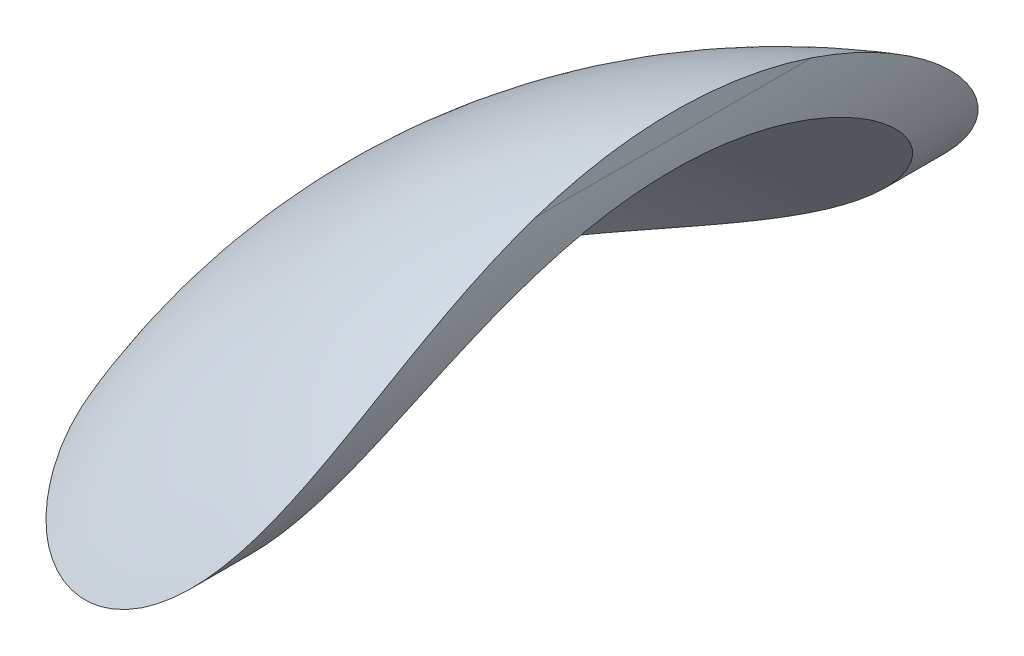
ISO-10303-21;
HEADER;
FILE_DESCRIPTION(('STEP AP214'),'2;1');
FILE_NAME('part.step','',(''),(''),'','','');
FILE_SCHEMA(('AUTOMOTIVE_DESIGN { 1 0 10303 214 1 1 1 1 }'));
ENDSEC;
DATA;
#1=APPLICATION_CONTEXT('core data for automotive mechanical design processes');
#2=APPLICATION_PROTOCOL_DEFINITION('international standard','automotive_design',2000,#1);
#3=PRODUCT_CONTEXT('',#1,'mechanical');
#4=PRODUCT('Part','Part','',(#3));
#5=PRODUCT_RELATED_PRODUCT_CATEGORY('part','',(#4));
#6=PRODUCT_DEFINITION_FORMATION('','',#4);
#7=PRODUCT_DEFINITION_CONTEXT('part definition',#1,'design');
#8=PRODUCT_DEFINITION('design','',#6,#7);
#9=PRODUCT_DEFINITION_SHAPE('','',#8);
#10=(LENGTH_UNIT() NAMED_UNIT(*) SI_UNIT(.MILLI.,.METRE.));
#11=(NAMED_UNIT(*) PLANE_ANGLE_UNIT() SI_UNIT($,.RADIAN.));
#12=(NAMED_UNIT(*) SI_UNIT($,.STERADIAN.) SOLID_ANGLE_UNIT());
#13=UNCERTAINTY_MEASURE_WITH_UNIT(LENGTH_MEASURE(1.E-05),#10,'distance_accuracy_value','');
#14=(GEOMETRIC_REPRESENTATION_CONTEXT(3) GLOBAL_UNCERTAINTY_ASSIGNED_CONTEXT((#13)) GLOBAL_UNIT_ASSIGNED_CONTEXT((#10,
#11,#12)) REPRESENTATION_CONTEXT('',''));
#15=CARTESIAN_POINT('',(0.,0.,0.));
#16=DIRECTION('',(0.,0.,1.));
#17=DIRECTION('',(1.,0.,0.));
#18=AXIS2_PLACEMENT_3D('',#15,#16,#17);
#19=CARTESIAN_POINT('',(0.,36.,0.));
#20=DIRECTION('',(0.,1.,0.));
#21=DIRECTION('',(-1.,0.,0.));
#22=AXIS2_PLACEMENT_3D('',#19,#20,#21);
#23=CIRCLE('',#22,17.);
#24=TRIMMED_CURVE('',#23,(PARAMETER_VALUE(-3.14159265358979)),
(PARAMETER_VALUE(3.14159265358979)),.T.,.PARAMETER.);
#25=CARTESIAN_POINT('',(17.,36.,0.));
#26=DIRECTION('',(0.,0.,-1.));
#27=AXIS1_PLACEMENT('',#25,#26);
#28=SURFACE_OF_REVOLUTION('',#24,#27);
#29=CARTESIAN_POINT('',(-10.,54.,7.09215695624266));
#30=CARTESIAN_POINT('',(-9.90105868243062,54.0000060865467,7.2715082776682));
#31=CARTESIAN_POINT('',(-9.79798799462409,54.000979208065,7.44859834177649));
#32=CARTESIAN_POINT('',(-9.58363051501969,54.0053947287687,7.79789055376422));
#33=CARTESIAN_POINT('',(-9.47233735672496,54.0088390597231,7.97008876809118));
#34=CARTESIAN_POINT('',(-9.24170628345666,54.0187350085244,8.30898858921577));
#35=CARTESIAN_POINT('',(-9.12236652293891,54.0251873182927,8.47568892189089));
#36=CARTESIAN_POINT('',(-8.87518839991979,54.0417170481246,8.80392150611222));
#37=CARTESIAN_POINT('',(-8.74730702813071,54.0518141502941,8.96542041028897));
#38=CARTESIAN_POINT('',(-8.48393053523839,54.0762265136883,9.2817058049186));
#39=CARTESIAN_POINT('',(-8.34843711672695,54.0905408346607,9.43649378279428));
#40=CARTESIAN_POINT('',(-8.0701847233763,54.1239974352365,9.73882365283748));
#41=CARTESIAN_POINT('',(-7.92742612123584,54.1431394673805,9.88636591594355));
#42=CARTESIAN_POINT('',(-7.56078792356969,54.1979764152567,10.2466564134348));
#43=CARTESIAN_POINT('',(-7.33252595192126,54.2371409494919,10.4544721785029));
#44=CARTESIAN_POINT('',(-6.86236777773813,54.3298717541419,10.8505939224528));
#45=CARTESIAN_POINT('',(-6.62047067378539,54.3834389776024,11.0388986091168));
#46=CARTESIAN_POINT('',(-6.1262162798958,54.5066065304424,11.3938760617822));
#47=CARTESIAN_POINT('',(-5.87389106470666,54.5761603187289,11.5606094670569));
#48=CARTESIAN_POINT('',(-5.36106232343689,54.7328313703029,11.8717470126975));
#49=CARTESIAN_POINT('',(-5.10055968058707,54.8199467422651,12.016153554637));
#50=CARTESIAN_POINT('',(-4.59526016567866,55.0051645856307,12.2712914981646));
#51=CARTESIAN_POINT('',(-4.35083439238189,55.1018689972162,12.3837759690584));
#52=CARTESIAN_POINT('',(-3.86045181243636,55.3114271935835,12.5885647338073));
#53=CARTESIAN_POINT('',(-3.61449505705686,55.4242804403292,12.6808696997307));
#54=CARTESIAN_POINT('',(-3.12352859737936,55.6662419827405,12.8451692968098));
#55=CARTESIAN_POINT('',(-2.87851981692398,55.7953633154792,12.9171474866478));
#56=CARTESIAN_POINT('',(-2.3922333381954,56.06942504613,13.0406780403534));
#57=CARTESIAN_POINT('',(-2.15095550449742,56.2143648683212,13.0922311472849));
#58=CARTESIAN_POINT('',(-1.69131396194676,56.5086072938328,13.1720777269069));
#59=CARTESIAN_POINT('',(-1.47253239615305,56.6568855648932,13.2017524276154));
#60=CARTESIAN_POINT('',(-1.0420467202903,56.9656646807537,13.2435909118597));
#61=CARTESIAN_POINT('',(-0.83034221607976,57.1261648432449,13.2557556721657));
#62=CARTESIAN_POINT('',(-0.41566970453251,57.4582862389076,13.2626114504365));
#63=CARTESIAN_POINT('',(-0.212698744630636,57.6299036636967,13.2573084215424));
#64=CARTESIAN_POINT('',(0.183173124490594,57.983043090212,13.2292253877149));
#65=CARTESIAN_POINT('',(0.376073930382359,58.1645651935287,13.2064452034898));
#66=CARTESIAN_POINT('',(0.750071857976493,58.5355295338204,13.1434307021884));
#67=CARTESIAN_POINT('',(0.931199149095012,58.7249493062611,13.1032431969488));
#68=CARTESIAN_POINT('',(1.2811838417351,59.1104767615005,13.0053520453278));
#69=CARTESIAN_POINT('',(1.45004138796096,59.3065843653856,12.9476486055637));
#70=CARTESIAN_POINT('',(1.77464372157792,59.7035762049356,12.8147082297684));
#71=CARTESIAN_POINT('',(1.93039119623717,59.9044594508228,12.7394748989402));
#72=CARTESIAN_POINT('',(2.22824111531833,60.3090151764394,12.5715384993016));
#73=CARTESIAN_POINT('',(2.37034360827497,60.5126876462448,12.4788354926337));
#74=CARTESIAN_POINT('',(2.64050687471467,60.9205577488878,12.2762557401469));
#75=CARTESIAN_POINT('',(2.76857730468861,61.124754920334,12.1663909325312));
#76=CARTESIAN_POINT('',(3.01076995257673,61.5316713437587,11.9298614007588));
#77=CARTESIAN_POINT('',(3.12489225792392,61.7343906049938,11.8031967819211));
#78=CARTESIAN_POINT('',(3.33946325521924,62.1362821896751,11.5336848746318));
#79=CARTESIAN_POINT('',(3.4399111272439,62.335454299811,11.3908366167441));
#80=CARTESIAN_POINT('',(3.62766160272476,62.7282979247084,11.0897819280073));
#81=CARTESIAN_POINT('',(3.71496381335952,62.9219692749547,10.9315750384405));
#82=CARTESIAN_POINT('',(3.88053819782568,63.3099237255637,10.5939417027983));
#83=CARTESIAN_POINT('',(3.95828791509912,63.5039011741397,10.4139084373058));
#84=CARTESIAN_POINT('',(4.1014215104651,63.8823008744403,10.0394850308557));
#85=CARTESIAN_POINT('',(4.16680509733521,64.0667229010605,9.84509455193553));
#86=CARTESIAN_POINT('',(4.2864273894923,64.4246725189078,9.44320106005376));
#87=CARTESIAN_POINT('',(4.3406626137561,64.5981966956233,9.2356939778596));
#88=CARTESIAN_POINT('',(4.439238946855,64.933198568557,8.80892707008353));
#89=CARTESIAN_POINT('',(4.4835788085369,65.094674744611,8.58966576738301));
#90=CARTESIAN_POINT('',(4.56913632136534,65.42600505296,8.10987137317313));
#91=CARTESIAN_POINT('',(4.60908970704305,65.5939660970732,7.84780467983986));
#92=CARTESIAN_POINT('',(4.67966511691762,65.9122799144506,7.31199543103473));
#93=CARTESIAN_POINT('',(4.71028643323911,66.0626313514222,7.03825199162876));
#94=CARTESIAN_POINT('',(4.76389492711926,66.3451747011281,6.48068083059862));
#95=CARTESIAN_POINT('',(4.78687850550703,66.4773580352574,6.19684842423877));
#96=CARTESIAN_POINT('',(4.82670383981941,66.7230856648512,5.62081802853676));
#97=CARTESIAN_POINT('',(4.8435452606057,66.8366289430612,5.32861958365123));
#98=CARTESIAN_POINT('',(4.87509351421215,67.0642362441262,4.68221614733304));
#99=CARTESIAN_POINT('',(4.88881757023498,67.1744535934525,4.32660408163413));
#100=CARTESIAN_POINT('',(4.91128111479605,67.3680735779839,3.60799431081621));
#101=CARTESIAN_POINT('',(4.92002009029322,67.4514734528752,3.24499584950407));
#102=CARTESIAN_POINT('',(4.93387876301776,67.5913787216016,2.51361910202883));
#103=CARTESIAN_POINT('',(4.93899681701417,67.6478719009608,2.14523845064355));
#104=CARTESIAN_POINT('',(4.9465298716766,67.7338663591566,1.40531603841123));
#105=CARTESIAN_POINT('',(4.94894476949845,67.7633666110134,1.03377415783403));
#106=CARTESIAN_POINT('',(4.95172680247294,67.7974008426505,0.241988484870862));
#107=CARTESIAN_POINT('',(4.95179322765221,67.7982676309586,-0.178418641905333));
#108=CARTESIAN_POINT('',(4.94913503948852,67.7656517544627,-1.01791967139099));
#109=CARTESIAN_POINT('',(4.94641016360782,67.732165858593,-1.43701344685311));
#110=CARTESIAN_POINT('',(4.93746713858115,67.6308135879049,-2.27137681954633));
#111=CARTESIAN_POINT('',(4.93124591159695,67.5629169264649,-2.68664271927989));
#112=CARTESIAN_POINT('',(4.91389322191333,67.3927982475849,-3.5099834879023));
#113=CARTESIAN_POINT('',(4.90276189434334,67.2905771747954,-3.91805855436657));
#114=CARTESIAN_POINT('',(4.87318835002513,67.0498064317697,-4.73124600261338));
#115=CARTESIAN_POINT('',(4.85461639248842,66.9106276950221,-5.13616833755762));
#116=CARTESIAN_POINT('',(4.80716576341052,66.5973038130857,-5.93171479419174));
#117=CARTESIAN_POINT('',(4.77828576490568,66.4231541673225,-6.32233706788011));
#118=CARTESIAN_POINT('',(4.7065451618489,66.0410762028488,-7.08463106581984));
#119=CARTESIAN_POINT('',(4.66371039396609,65.8332106621168,-7.45633635471443));
#120=CARTESIAN_POINT('',(4.585763083299,65.4973344116429,-7.99667219036317));
#121=CARTESIAN_POINT('',(4.55750245799856,65.3813784877647,-8.17389294957009));
#122=CARTESIAN_POINT('',(4.49581700371876,65.1416817463484,-8.52214061856858));
#123=CARTESIAN_POINT('',(4.46239095515515,65.0179390944227,-8.69316605380866));
#124=CARTESIAN_POINT('',(4.37530511911418,64.7122316229316,-9.0952226660856));
#125=CARTESIAN_POINT('',(4.31889170735498,64.5267246356261,-9.32299037630716));
#126=CARTESIAN_POINT('',(4.19319890378389,64.1426436060439,-9.76337341580591));
#127=CARTESIAN_POINT('',(4.12392276341682,63.9440728741974,-9.97599255559092));
#128=CARTESIAN_POINT('',(3.97099219015851,63.5356726709689,-10.3843534446396));
#129=CARTESIAN_POINT('',(3.88734707277181,63.3258505541808,-10.5801060059226));
#130=CARTESIAN_POINT('',(3.70428089515355,62.8969653138406,-10.9533104106277));
#131=CARTESIAN_POINT('',(3.60485935301921,62.6779019081566,-11.1307616947501));
#132=CARTESIAN_POINT('',(3.38852660326758,62.2317536926062,-11.4669508280308));
#133=CARTESIAN_POINT('',(3.27151572880562,62.0046292024852,-11.6255721690339));
#134=CARTESIAN_POINT('',(3.01973092150118,61.5464833118873,-11.9217316627801));
#135=CARTESIAN_POINT('',(2.88495680077402,61.3154618702143,-12.0592695924872));
#136=CARTESIAN_POINT('',(2.59739420405793,60.8526150859345,-12.3124445714605));
#137=CARTESIAN_POINT('',(2.44460560518974,60.6207897378548,-12.4280814713225));
#138=CARTESIAN_POINT('',(2.1212425089156,60.1594801121345,-12.6369714478715));
#139=CARTESIAN_POINT('',(1.95066946235122,59.9299956452009,-12.7302263484184));
#140=CARTESIAN_POINT('',(1.61004460252862,59.4986944412265,-12.8861158769008));
#141=CARTESIAN_POINT('',(1.44158863444283,59.2963748438644,-12.950858939034));
#142=CARTESIAN_POINT('',(1.09157056300964,58.8981527663024,-13.0620133159372));
#143=CARTESIAN_POINT('',(0.9100093616226,58.702249845825,-13.1084258908724));
#144=CARTESIAN_POINT('',(0.534816431537772,58.3187261849677,-13.1829901195388));
#145=CARTESIAN_POINT('',(0.341185303104414,58.1311050335085,-13.2111426805884));
#146=CARTESIAN_POINT('',(-0.0569118000281092,57.7657673947571,-13.2492645697153));
#147=CARTESIAN_POINT('',(-0.261377829075329,57.5880509571562,-13.2592338065759));
#148=CARTESIAN_POINT('',(-0.674947613896879,57.2478313234766,-13.2610000690444));
#149=CARTESIAN_POINT('',(-0.88384131994863,57.0850746635807,-13.2532037204242));
#150=CARTESIAN_POINT('',(-1.30905294016354,56.7714586183059,-13.2202491028031));
#151=CARTESIAN_POINT('',(-1.52537067468722,56.6205989453459,-13.195091253618));
#152=CARTESIAN_POINT('',(-1.96369833023869,56.331663478636,-13.1273538055335));
#153=CARTESIAN_POINT('',(-2.18570748436656,56.1935859739727,-13.0847765423966));
#154=CARTESIAN_POINT('',(-2.63357792010385,55.9308289240615,-12.9821311085892));
#155=CARTESIAN_POINT('',(-2.85943919889467,55.8061493690107,-12.9220629507164));
#156=CARTESIAN_POINT('',(-3.31302328563387,55.5705674702138,-12.7844101006798));
#157=CARTESIAN_POINT('',(-3.54074623013894,55.4596661469685,-12.7068241122349));
#158=CARTESIAN_POINT('',(-3.99593125758116,55.2517722941137,-12.5342269553568));
#159=CARTESIAN_POINT('',(-4.22339334247355,55.1547796595684,-12.4392159184012));
#160=CARTESIAN_POINT('',(-4.67580431695612,54.9745872761275,-12.2320719141414));
#161=CARTESIAN_POINT('',(-4.90075444416299,54.8913804276878,-12.1199478174133));
#162=CARTESIAN_POINT('',(-5.34617165864647,54.738255641689,-11.8789886336663));
#163=CARTESIAN_POINT('',(-5.56663872949686,54.6683377528137,-11.7501534854298));
#164=CARTESIAN_POINT('',(-6.00365245424975,54.5403438265948,-11.4748325797746));
#165=CARTESIAN_POINT('',(-6.22012375333623,54.4824148785474,-11.328159067712));
#166=CARTESIAN_POINT('',(-6.64464399743387,54.3784626097793,-11.0192478812636));
#167=CARTESIAN_POINT('',(-6.85269269704241,54.3324396357432,-10.8570097538475));
#168=CARTESIAN_POINT('',(-7.25910818808094,54.2510834963211,-10.5177429074248));
#169=CARTESIAN_POINT('',(-7.45745939228515,54.2157670950674,-10.3406915415257));
#170=CARTESIAN_POINT('',(-7.84283385654862,54.1546403250078,-9.97317200180671));
#171=CARTESIAN_POINT('',(-8.02985761457036,54.1288295380746,-9.78270441857052));
#172=CARTESIAN_POINT('',(-8.38424295893716,54.0862518113949,-9.39752762659029));
#173=CARTESIAN_POINT('',(-8.55209427708538,54.0691606549168,-9.20330340232351));
#174=CARTESIAN_POINT('',(-8.87580931819832,54.0413040512027,-8.80466243473498));
#175=CARTESIAN_POINT('',(-9.03167192969893,54.0305391898599,-8.60024474927376));
#176=CARTESIAN_POINT('',(-9.33034272910352,54.0142107850525,-8.1830913722897));
#177=CARTESIAN_POINT('',(-9.47319849344269,54.0086275369969,-7.97039042429367));
#178=CARTESIAN_POINT('',(-9.74618924779305,54.0015301060494,-7.53701903790976));
#179=CARTESIAN_POINT('',(-9.87632913060152,54.0000143520849,-7.31635170992861));
#180=CARTESIAN_POINT('',(-10.,54.,-7.09215695624266));
#181=B_SPLINE_CURVE_WITH_KNOTS('',3,(#29,#30,#31,#32,#33,#34,#35,#36,#37,#38,#39,#40,#41,#42,
#43,#44,#45,#46,#47,#48,#49,#50,#51,#52,#53,#54,#55,#56,#57,#58,#59,#60,#61,#62,#63,#64,#65,#66,
#67,#68,#69,#70,#71,#72,#73,#74,#75,#76,#77,#78,#79,#80,#81,#82,#83,#84,#85,#86,#87,#88,#89,#90,
#91,#92,#93,#94,#95,#96,#97,#98,#99,#100,#101,#102,#103,#104,#105,#106,#107,#108,#109,#110,#111,
#112,#113,#114,#115,#116,#117,#118,#119,#120,#121,#122,#123,#124,#125,#126,#127,#128,#129,#130,
#131,#132,#133,#134,#135,#136,#137,#138,#139,#140,#141,#142,#143,#144,#145,#146,#147,#148,#149,
#150,#151,#152,#153,#154,#155,#156,#157,#158,#159,#160,#161,#162,#163,#164,#165,#166,#167,#168,
#169,#170,#171,#172,#173,#174,#175,#176,#177,#178,#179,#180),.UNSPECIFIED.,.F.,.F.,(4,2,2,2,2,2,
2,2,2,2,2,2,2,2,2,2,2,2,2,2,2,2,2,2,2,2,2,2,2,2,2,2,2,2,2,2,2,2,2,2,2,2,2,2,2,2,2,2,2,2,2,2,2,2,
2,2,2,2,2,2,2,2,2,2,2,2,2,2,2,2,2,2,2,2,2,4),(0.,0.614462789054285,1.22940643386501,
1.84449160322631,2.46294921602582,3.08126904449609,3.69955718551027,4.63180247191652,
5.56410946146874,6.49373588888528,7.423262252004,8.27986807105223,9.13644535692379,
9.99371351397509,10.8509504807741,11.6478778603788,12.4447607826574,13.2413721499236,
14.0379916894343,14.8324821288503,15.6269631968541,16.421281015621,17.2155960089228,
18.0093608962768,18.8031208077076,19.5969282922977,20.3907594929053,21.2174055130515,
22.0440709982924,22.8709942151106,23.6980215936761,24.6385848215366,25.5792193771912,
26.5202965664544,27.4614250966085,28.5779503508548,29.6945904919151,30.8117370572904,
31.9289261241376,33.1887090539481,34.4486104843852,35.7096227473386,36.9706003085089,
38.2545951825491,39.5387554060865,40.8205514458953,41.4612911271284,42.1021823222451,
42.9986074426103,43.8948062720712,44.7904262675021,45.6860736255887,46.5870019372995,
47.4879397790376,48.3888837665543,49.2897543131759,50.1021005676275,50.9143909660139,
51.7266409995648,52.538895107762,53.3327452602067,54.1265762173556,54.920300764885,
55.7140247316681,56.5078074515459,57.3015841823209,58.0949508466227,58.888320417349,
59.6909116736873,60.493526297686,61.2973912245634,62.1012207872881,62.8724632177149,
63.6437770634916,64.4121455990815,65.1802173090201),.UNSPECIFIED.);
#182=CARTESIAN_POINT('',(-10.,54.,7.09215695624266));
#183=VERTEX_POINT('',#182);
#184=CARTESIAN_POINT('',(-10.,54.,-7.09215695624266));
#185=VERTEX_POINT('',#184);
#186=EDGE_CURVE('E59',#183,#185,#181,.T.);
#187=ORIENTED_EDGE('',*,*,#186,.F.);
#188=CARTESIAN_POINT('',(-10.,54.,7.09215695624266));
#189=CARTESIAN_POINT('',(-10.1326914182136,54.,6.85166697774871));
#190=CARTESIAN_POINT('',(-10.2588716842559,54.,6.60757435634803));
#191=CARTESIAN_POINT('',(-10.4977389455596,54.,6.1128161387935));
#192=CARTESIAN_POINT('',(-10.6104232828268,54.,5.86214925966479));
#193=CARTESIAN_POINT('',(-10.8217800160216,54.,5.35495826829033));
#194=CARTESIAN_POINT('',(-10.9204517664745,54.,5.09843388685642));
#195=CARTESIAN_POINT('',(-11.1032021226351,54.,4.58069376518055));
#196=CARTESIAN_POINT('',(-11.1873035989728,54.,4.31948610071088));
#197=CARTESIAN_POINT('',(-11.3407239245151,54.,3.79278429583712));
#198=CARTESIAN_POINT('',(-11.4100438978348,54.,3.52729048304239));
#199=CARTESIAN_POINT('',(-11.5335954909256,54.,2.99282200950797));
#200=CARTESIAN_POINT('',(-11.5878275720287,54.,2.7238474554597));
#201=CARTESIAN_POINT('',(-11.6810531754586,54.,2.18271121766912));
#202=CARTESIAN_POINT('',(-11.7200157966466,54.,1.91054420732619));
#203=CARTESIAN_POINT('',(-11.7823688747641,54.,1.36441865246689));
#204=CARTESIAN_POINT('',(-11.8057586082541,54.,1.09046002531777));
#205=CARTESIAN_POINT('',(-11.8368549386922,54.,0.54165013655584));
#206=CARTESIAN_POINT('',(-11.8445613315804,54.,0.2667988633752));
#207=CARTESIAN_POINT('',(-11.8442545857115,54.,-0.282893284779844));
#208=CARTESIAN_POINT('',(-11.8362415401257,54.,-0.557734159806223));
#209=CARTESIAN_POINT('',(-11.8045335251949,54.,-1.1065057389607));
#210=CARTESIAN_POINT('',(-11.7808387612902,54.,-1.3804364549652));
#211=CARTESIAN_POINT('',(-11.7178786809438,54.,-1.92648858184767));
#212=CARTESIAN_POINT('',(-11.6786141163588,54.,-2.19861007944669));
#213=CARTESIAN_POINT('',(-11.5849410729745,54.,-2.73876569650128));
#214=CARTESIAN_POINT('',(-11.5306128935634,54.,-3.00681375144427));
#215=CARTESIAN_POINT('',(-11.4069713771056,54.,-3.53943756710592));
#216=CARTESIAN_POINT('',(-11.3376576285183,54.,-3.8040132322525));
#217=CARTESIAN_POINT('',(-11.18435001095,54.,-4.32889560838169));
#218=CARTESIAN_POINT('',(-11.1003550561281,54.,-4.58920200204474));
#219=CARTESIAN_POINT('',(-10.9179178005087,54.,-5.10515635069799));
#220=CARTESIAN_POINT('',(-10.8194531927062,54.,-5.36079641523964));
#221=CARTESIAN_POINT('',(-10.6086051517774,54.,-5.86625276380348));
#222=CARTESIAN_POINT('',(-10.4962223386244,54.,-6.1160693066403));
#223=CARTESIAN_POINT('',(-10.2580474878098,54.,-6.60916839573377));
#224=CARTESIAN_POINT('',(-10.1322580383259,54.,-6.85245219183754));
#225=CARTESIAN_POINT('',(-10.,54.,-7.09215695624266));
#226=B_SPLINE_CURVE_WITH_KNOTS('',3,(#188,#189,#190,#191,#192,#193,#194,#195,#196,#197,#198,
#199,#200,#201,#202,#203,#204,#205,#206,#207,#208,#209,#210,#211,#212,#213,#214,#215,#216,#217,
#218,#219,#220,#221,#222,#223,#224,#225),.UNSPECIFIED.,.F.,.F.,(4,2,2,2,2,2,2,2,2,2,2,2,2,2,2,2,
2,2,4),(0.,0.823916483665043,1.64799496999234,2.47211140430641,3.29492228458403,
4.11767056876751,4.94039369358526,5.76477328806216,6.58919117647086,7.41361979151221,
8.23804352006876,9.0624564483768,9.88682957110611,10.7068900184334,11.526972989504,
12.3471166406488,13.1685381869712,13.9899231570055,14.8111498432854),.UNSPECIFIED.);
#227=EDGE_CURVE('E23',#183,#185,#226,.T.);
#228=ORIENTED_EDGE('',*,*,#227,.T.);
#229=EDGE_LOOP('',(#187,#228));
#230=FACE_BOUND('',#229,.T.);
#231=ADVANCED_FACE('F18',(#230),#28,.T.);
#232=CARTESIAN_POINT('',(5.,73.8373244588231,0.));
#233=DIRECTION('',(-1.,0.,0.));
#234=DIRECTION('',(0.,0.,1.));
#235=AXIS2_PLACEMENT_3D('',#232,#233,#234);
#236=PLANE('',#235);
#237=DIRECTION('',(0.,0.,1.));
#238=VECTOR('',#237,1.);
#239=CARTESIAN_POINT('',(5.,68.9999999999999,0.));
#240=LINE('',#239,#238);
#241=CARTESIAN_POINT('',(5.,68.9999999999999,-5.73405536190609));
#242=VERTEX_POINT('',#241);
#243=CARTESIAN_POINT('',(5.,68.9999999999966,5.73405536192639));
#244=VERTEX_POINT('',#243);
#245=EDGE_CURVE('E66',#242,#244,#240,.T.);
#246=ORIENTED_EDGE('',*,*,#245,.F.);
#247=CARTESIAN_POINT('',(5.,68.9999999999933,5.73405536192586));
#248=CARTESIAN_POINT('',(5.,69.0816547197566,5.49163548079192));
#249=CARTESIAN_POINT('',(5.,69.1581498973639,5.24751113968805));
#250=CARTESIAN_POINT('',(5.,69.30068745881,4.75622668026471));
#251=CARTESIAN_POINT('',(5.,69.3667297145695,4.50906652478748));
#252=CARTESIAN_POINT('',(5.,69.5489474844148,3.76370834366755));
#253=CARTESIAN_POINT('',(5.,69.6492493758536,3.26152759843343));
#254=CARTESIAN_POINT('',(5.,69.80447966243,2.26398869155381));
#255=CARTESIAN_POINT('',(5.,69.8605461180352,1.7688054146851));
#256=CARTESIAN_POINT('',(5.,69.9312511192599,0.775516701976653));
#257=CARTESIAN_POINT('',(5.,69.9458944019785,0.277411606801138));
#258=CARTESIAN_POINT('',(5.,69.9340839564385,-0.682515371080755));
#259=CARTESIAN_POINT('',(5.,69.910504801,-1.14437517230498));
#260=CARTESIAN_POINT('',(5.,69.8277339661746,-2.06488158893523));
#261=CARTESIAN_POINT('',(5.,69.7685425136743,-2.52352822479356));
#262=CARTESIAN_POINT('',(5.,69.6129808879056,-3.4465242410487));
#263=CARTESIAN_POINT('',(5.,69.5157040876879,-3.91072232579533));
#264=CARTESIAN_POINT('',(5.,69.3425788567979,-4.60009097490187));
#265=CARTESIAN_POINT('',(5.,69.2803252017928,-4.82875617332322));
#266=CARTESIAN_POINT('',(5.,69.1468566140966,-5.28345425763106));
#267=CARTESIAN_POINT('',(5.,69.0756417547107,-5.50948716503397));
#268=CARTESIAN_POINT('',(4.99999999999999,68.9999999999999,-5.73405536190609));
#269=B_SPLINE_CURVE_WITH_KNOTS('',3,(#247,#248,#249,#250,#251,#252,#253,#254,#255,#256,#257,
#258,#259,#260,#261,#262,#263,#264,#265,#266,#267,#268),.UNSPECIFIED.,.F.,.F.,(4,2,2,2,2,2,2,2,
2,2,4),(0.,0.767285817912628,1.53458103662792,3.0688401508421,4.56220767763446,6.05540441798804,
7.44141654937121,8.82741985053713,10.2486469181446,10.9594523522643,11.6702519721596),.UNSPECIFIED.);
#270=EDGE_CURVE('E103',#244,#242,#269,.T.);
#271=ORIENTED_EDGE('',*,*,#270,.F.);
#272=EDGE_LOOP('',(#246,#271));
#273=FACE_BOUND('',#272,.T.);
#274=ADVANCED_FACE('F110',(#273),#236,.F.);
#275=CARTESIAN_POINT('',(-9.99999999999999,54.,0.));
#276=DIRECTION('',(0.,1.,0.));
#277=DIRECTION('',(-1.,0.,0.));
#278=AXIS2_PLACEMENT_3D('',#275,#276,#277);
#279=PLANE('',#278);
#280=DIRECTION('',(0.,0.,1.));
#281=VECTOR('',#280,1.);
#282=CARTESIAN_POINT('',(-10.,54.,0.));
#283=LINE('',#282,#281);
#284=CARTESIAN_POINT('',(-9.9999999999901,54.,-11.0588738256766));
#285=VERTEX_POINT('',#284);
#286=EDGE_CURVE('E60',#185,#285,#283,.F.);
#287=ORIENTED_EDGE('',*,*,#286,.F.);
#288=ORIENTED_EDGE('',*,*,#227,.F.);
#289=DIRECTION('',(0.,0.,1.));
#290=VECTOR('',#289,1.);
#291=CARTESIAN_POINT('',(-10.,54.,0.));
#292=LINE('',#291,#290);
#293=CARTESIAN_POINT('',(-10.,54.,11.0588738256651));
#294=VERTEX_POINT('',#293);
#295=EDGE_CURVE('E43',#294,#183,#292,.F.);
#296=ORIENTED_EDGE('',*,*,#295,.F.);
#297=CARTESIAN_POINT('',(-9.9999999999901,54.,-11.0588738256766));
#298=CARTESIAN_POINT('',(-10.2090150763716,54.,-10.8159295217872));
#299=CARTESIAN_POINT('',(-10.4116040603422,54.,-10.5674379205435));
#300=CARTESIAN_POINT('',(-10.8032271336974,54.,-10.059870707935));
#301=CARTESIAN_POINT('',(-10.9922569097393,54.,-9.80079176939416));
#302=CARTESIAN_POINT('',(-11.3559403173579,54.,-9.272693573345));
#303=CARTESIAN_POINT('',(-11.5305927754949,54.,-9.00367350705852));
#304=CARTESIAN_POINT('',(-11.8649484309346,54.,-8.45613796044239));
#305=CARTESIAN_POINT('',(-12.0246369774096,54.,-8.1776135310677));
#306=CARTESIAN_POINT('',(-12.3281851507892,54.,-7.61209528375628));
#307=CARTESIAN_POINT('',(-12.4720464042803,54.,-7.32510233998885));
#308=CARTESIAN_POINT('',(-12.7433281141613,54.,-6.74347918968247));
#309=CARTESIAN_POINT('',(-12.8707491194519,54.,-6.44884923851956));
#310=CARTESIAN_POINT('',(-13.1684521814507,54.,-5.7027996724875));
#311=CARTESIAN_POINT('',(-13.3280522260542,54.,-5.24706291095442));
#312=CARTESIAN_POINT('',(-13.6072224255016,54.,-4.32350135849266));
#313=CARTESIAN_POINT('',(-13.726790812617,54.,-3.85567603473643));
#314=CARTESIAN_POINT('',(-13.9245897536735,54.,-2.91182144199901));
#315=CARTESIAN_POINT('',(-14.0028602659908,54.,-2.43580056507683));
#316=CARTESIAN_POINT('',(-14.1174188200702,54.,-1.47874778325454));
#317=CARTESIAN_POINT('',(-14.1537085190616,54.,-0.997716076917751));
#318=CARTESIAN_POINT('',(-14.1834685381634,54.,-0.0491730967873298));
#319=CARTESIAN_POINT('',(-14.1782235251584,54.,0.418298178813072));
#320=CARTESIAN_POINT('',(-14.1280089759009,54.,1.35108307053335));
#321=CARTESIAN_POINT('',(-14.0830398751039,54.,1.81639671024901));
#322=CARTESIAN_POINT('',(-13.9537612243678,54.,2.74184079814796));
#323=CARTESIAN_POINT('',(-13.8694302743373,54.,3.20196828720608));
#324=CARTESIAN_POINT('',(-13.71409328655,54.,3.88544189571518));
#325=CARTESIAN_POINT('',(-13.657504835349,54.,4.1121553038368));
#326=CARTESIAN_POINT('',(-13.5348341893483,54.,4.56305824297773));
#327=CARTESIAN_POINT('',(-13.4687497538247,54.,4.78724716480341));
#328=CARTESIAN_POINT('',(-13.2572988004783,54.,5.45282948014952));
#329=CARTESIAN_POINT('',(-13.0981250021406,54.,5.8899120429961));
#330=CARTESIAN_POINT('',(-12.7443285959859,54.,6.74948024410653));
#331=CARTESIAN_POINT('',(-12.5497050828185,54.,7.17196550924197));
#332=CARTESIAN_POINT('',(-12.232691508978,54.,7.79248552558937));
#333=CARTESIAN_POINT('',(-12.1228940894935,54.,7.99703764819043));
#334=CARTESIAN_POINT('',(-11.8951841026042,54.,8.40150577573114));
#335=CARTESIAN_POINT('',(-11.7772734031927,54.,8.60142283376575));
#336=CARTESIAN_POINT('',(-11.411780992048,54.,9.1937413105811));
#337=CARTESIAN_POINT('',(-11.1523257122914,54.,9.57893129459971));
#338=CARTESIAN_POINT('',(-10.739126052898,54.,10.1433877913384));
#339=CARTESIAN_POINT('',(-10.5961984306236,54.,10.3307028681759));
#340=CARTESIAN_POINT('',(-10.3033315056438,54.,10.6992804619982));
#341=CARTESIAN_POINT('',(-10.1534038043375,54.,10.8805521958279));
#342=CARTESIAN_POINT('',(-10.,54.,11.0588738256651));
#343=B_SPLINE_CURVE_WITH_KNOTS('',3,(#297,#298,#299,#300,#301,#302,#303,#304,#305,#306,#307,
#308,#309,#310,#311,#312,#313,#314,#315,#316,#317,#318,#319,#320,#321,#322,#323,#324,#325,#326,
#327,#328,#329,#330,#331,#332,#333,#334,#335,#336,#337,#338,#339,#340,#341,#342),.UNSPECIFIED.,
.F.,.F.,(4,2,2,2,2,2,2,2,2,2,2,2,2,2,2,2,2,2,2,2,2,2,4),(0.,0.961357518214055,1.92301951157366,
2.88475991565453,3.84743230922324,4.81000567540505,5.77254689524412,7.21927409680257,
8.66606517489634,10.1114538096171,11.5567853844096,12.9575916340695,14.3583825282814,
15.7599358875065,16.4607657611468,17.1617612787972,18.5555519689895,19.9493782602044,
20.6456826731009,21.3418273025672,22.7333729410402,23.440075970732,24.1456466845742),.UNSPECIFIED.);
#344=EDGE_CURVE('E34',#285,#294,#343,.T.);
#345=ORIENTED_EDGE('',*,*,#344,.F.);
#346=EDGE_LOOP('',(#287,#288,#296,#345));
#347=FACE_BOUND('',#346,.T.);
#348=ADVANCED_FACE('F61',(#347),#279,.F.);
#349=CARTESIAN_POINT('',(-10.,69.,0.));
#350=DIRECTION('',(0.,0.,1.));
#351=DIRECTION('',(1.,0.,0.));
#352=AXIS2_PLACEMENT_3D('',#349,#350,#351);
#353=CYLINDRICAL_SURFACE('',#352,15.);
#354=CARTESIAN_POINT('',(5.00000000000001,68.9999999999999,-5.73405536190609));
#355=CARTESIAN_POINT('',(4.99998305020157,68.9113281978612,-5.99732071218993));
#356=CARTESIAN_POINT('',(4.99921304043246,68.8163146660441,-6.25846822077103));
#357=CARTESIAN_POINT('',(4.9953692998368,68.6135708460352,-6.77607266753894));
#358=CARTESIAN_POINT('',(4.99229317255083,68.5058274274484,-7.0325244418416));
#359=CARTESIAN_POINT('',(4.98303467206555,68.2777349117486,-7.53982157824495));
#360=CARTESIAN_POINT('',(4.97685119709026,68.1573813554328,-7.79066491878241));
#361=CARTESIAN_POINT('',(4.96040610560873,67.9033852777412,-8.28753251329984));
#362=CARTESIAN_POINT('',(4.95011736551995,67.7696588961924,-8.53351306003452));
#363=CARTESIAN_POINT('',(4.92444927450648,67.4898542719087,-9.01797855456729));
#364=CARTESIAN_POINT('',(4.90907161125536,67.343780136084,-9.25646595869436));
#365=CARTESIAN_POINT('',(4.87213069344578,67.0395930808,-9.72506929674281));
#366=CARTESIAN_POINT('',(4.85056874691675,66.8814827122974,-9.95518698934522));
#367=CARTESIAN_POINT('',(4.79368280970311,66.5119865408473,-10.4634243875113));
#368=CARTESIAN_POINT('',(4.75625485354282,66.2972645923495,-10.7389026510614));
#369=CARTESIAN_POINT('',(4.66744603800608,65.8507420852249,-11.2732919958445));
#370=CARTESIAN_POINT('',(4.61606558767305,65.6189420274199,-11.5322035624863));
#371=CARTESIAN_POINT('',(4.4970926786315,65.1406148689388,-12.0307416356401));
#372=CARTESIAN_POINT('',(4.4295450401803,64.8941298738234,-12.2704190541554));
#373=CARTESIAN_POINT('',(4.27587254065954,64.3881295065935,-12.7292412018089));
#374=CARTESIAN_POINT('',(4.18974793447504,64.1286143132972,-12.9483862126025));
#375=CARTESIAN_POINT('',(3.99600122879772,63.5969732830313,-13.3661720935243));
#376=CARTESIAN_POINT('',(3.88818829795172,63.3247532582108,-13.5646053531515));
#377=CARTESIAN_POINT('',(3.64993110933008,62.7734830275884,-13.9369692884268));
#378=CARTESIAN_POINT('',(3.51948631872029,62.4944326611091,-14.1108993870091));
#379=CARTESIAN_POINT('',(3.23491880771786,61.9334707312266,-14.4330211118945));
#380=CARTESIAN_POINT('',(3.08079276643859,61.6515587717208,-14.5812091220948));
#381=CARTESIAN_POINT('',(2.74855443598693,61.0891875403198,-14.8510447360157));
#382=CARTESIAN_POINT('',(2.57044557507398,60.8087280667363,-14.9726961265525));
#383=CARTESIAN_POINT('',(2.21720046991111,60.2923137099263,-15.1740697935096));
#384=CARTESIAN_POINT('',(2.04512297452959,60.0556135861362,-15.2572750739629));
#385=CARTESIAN_POINT('',(1.68418153065353,59.5890027974316,-15.4039066652811));
#386=CARTESIAN_POINT('',(1.49531926952364,59.3590914531331,-15.4673349614332));
#387=CARTESIAN_POINT('',(1.10179721851826,58.9084397093275,-15.5745750162992));
#388=CARTESIAN_POINT('',(0.897138831216061,58.687698498255,-15.6183885143109));
#389=CARTESIAN_POINT('',(0.473266378026221,58.2574735235169,-15.6865996144105));
#390=CARTESIAN_POINT('',(0.25405229606349,58.0479897722845,-15.7109971950554));
#391=CARTESIAN_POINT('',(-0.188086484298771,57.6505041897062,-15.7399024058228));
#392=CARTESIAN_POINT('',(-0.410484827789793,57.4619726238911,-15.745189216547));
#393=CARTESIAN_POINT('',(-0.865716384970985,57.0983311541957,-15.7380713307645));
#394=CARTESIAN_POINT('',(-1.09854919249486,56.9232207286091,-15.7256673223026));
#395=CARTESIAN_POINT('',(-1.5728748097961,56.5875887193431,-15.6831044177374));
#396=CARTESIAN_POINT('',(-1.81436591948466,56.4270642932919,-15.6529489894533));
#397=CARTESIAN_POINT('',(-2.30412860569737,56.1214566955914,-15.574742089266));
#398=CARTESIAN_POINT('',(-2.55240020693722,55.976373580237,-15.5266905521212));
#399=CARTESIAN_POINT('',(-3.05388504740135,55.7021337586165,-15.4124624832722));
#400=CARTESIAN_POINT('',(-3.30710325697571,55.5729941384422,-15.3462667474554));
#401=CARTESIAN_POINT('',(-3.81596013077555,55.3311666332904,-15.1956500477364));
#402=CARTESIAN_POINT('',(-4.07159878066349,55.2184786509261,-15.1112291917267));
#403=CARTESIAN_POINT('',(-4.58286392653971,55.0096149769563,-14.924185942824));
#404=CARTESIAN_POINT('',(-4.83849040554852,54.9134346282068,-14.8215687001725));
#405=CARTESIAN_POINT('',(-5.34741762750572,54.7372514671476,-14.5982999361397));
#406=CARTESIAN_POINT('',(-5.6007184024673,54.6572484318383,-14.4776486633924));
#407=CARTESIAN_POINT('',(-6.10370199951113,54.5125007832655,-14.2181911401305));
#408=CARTESIAN_POINT('',(-6.35336604815402,54.4478191833502,-14.0793134440902));
#409=CARTESIAN_POINT('',(-6.84586265060548,54.3331885391902,-13.7844196073041));
#410=CARTESIAN_POINT('',(-7.08869475790859,54.2832404558489,-13.6284023496456));
#411=CARTESIAN_POINT('',(-7.56568141086905,54.1968627646287,-13.3000224917436));
#412=CARTESIAN_POINT('',(-7.79983233720744,54.1604387393371,-13.1276531783238));
#413=CARTESIAN_POINT('',(-8.25765915036256,54.0997457497289,-12.7676959304768));
#414=CARTESIAN_POINT('',(-8.48133726074821,54.0754741945166,-12.5801112498706));
#415=CARTESIAN_POINT('',(-8.93024959279639,54.0363961444384,-12.1789382557455));
#416=CARTESIAN_POINT('',(-9.15474981238152,54.0222556984032,-11.9644621366902));
#417=CARTESIAN_POINT('',(-9.48033708662446,54.0086120683143,-11.6322714664979));
#418=CARTESIAN_POINT('',(-9.58685971716773,54.0053246790404,-11.5199650227343));
#419=CARTESIAN_POINT('',(-9.79621505818892,54.001019270551,-11.2919411197113));
#420=CARTESIAN_POINT('',(-9.89904813211615,54.0000010272002,-11.1762239984863));
#421=CARTESIAN_POINT('',(-9.9999999999901,54.,-11.0588738256766));
#422=B_SPLINE_CURVE_WITH_KNOTS('',3,(#354,#355,#356,#357,#358,#359,#360,#361,#362,#363,#364,
#365,#366,#367,#368,#369,#370,#371,#372,#373,#374,#375,#376,#377,#378,#379,#380,#381,#382,#383,
#384,#385,#386,#387,#388,#389,#390,#391,#392,#393,#394,#395,#396,#397,#398,#399,#400,#401,#402,
#403,#404,#405,#406,#407,#408,#409,#410,#411,#412,#413,#414,#415,#416,#417,#418,#419,#420,#421),
.UNSPECIFIED.,.F.,.F.,(4,2,2,2,2,2,2,2,2,2,2,2,2,2,2,2,2,2,2,2,2,2,2,2,2,2,2,2,2,2,2,2,2,4),(0.,
0.833336651352345,1.66754048770219,2.50204031762372,3.34214750749418,4.18197636575026,
5.02162772376508,6.0744002971862,7.12714200994466,8.17699834168897,9.2268402698078,
10.2863588814503,11.3459024412994,12.4055947196809,13.4651356792825,14.3767032728795,
15.2881793304486,16.1995745489249,17.1109707739492,17.984759967205,18.8585151773087,
19.7320997520428,20.6056875115212,21.4802034847283,22.3547142809554,23.2289779526515,
24.103229572053,24.9810166608773,25.858860985342,26.7370672728018,27.6150862476527,
28.5465488721835,29.0109396034222,29.4752844623451),.UNSPECIFIED.);
#423=EDGE_CURVE('E87',#242,#285,#422,.T.);
#424=ORIENTED_EDGE('',*,*,#423,.F.);
#425=ORIENTED_EDGE('',*,*,#245,.T.);
#426=CARTESIAN_POINT('',(-10.,54.,11.0588738256651));
#427=CARTESIAN_POINT('',(-9.86118712740383,54.0000012371331,11.2202487983723));
#428=CARTESIAN_POINT('',(-9.71877917615217,54.0019270441886,11.3785552977416));
#429=CARTESIAN_POINT('',(-9.42696916382434,54.0102378533528,11.6886946455313));
#430=CARTESIAN_POINT('',(-9.27756167889854,54.0166263687159,11.8405222935031));
#431=CARTESIAN_POINT('',(-8.97213469973286,54.0344765358775,12.1371441699647));
#432=CARTESIAN_POINT('',(-8.81611375220029,54.0459393080127,12.2819368373739));
#433=CARTESIAN_POINT('',(-8.4973868362778,54.0745907972808,12.5644578358997));
#434=CARTESIAN_POINT('',(-8.33466071287837,54.091798079086,12.7021615702604));
#435=CARTESIAN_POINT('',(-8.00353890883009,54.1325202663355,12.9695228616344));
#436=CARTESIAN_POINT('',(-7.83514456701876,54.1560336912803,13.0991822984292));
#437=CARTESIAN_POINT('',(-7.49327276327277,54.209926500444,13.3500586655172));
#438=CARTESIAN_POINT('',(-7.31979565949802,54.2403054018908,13.471276188652));
#439=CARTESIAN_POINT('',(-6.87921650099161,54.325755968279,13.7642075310096));
#440=CARTESIAN_POINT('',(-6.60926811718937,54.3855358117737,13.9303382528619));
#441=CARTESIAN_POINT('',(-6.0619743458059,54.5234120765422,14.2415171653573));
#442=CARTESIAN_POINT('',(-5.7846283488008,54.6015100110378,14.3865636126656));
#443=CARTESIAN_POINT('',(-5.2261441555194,54.7769283700072,14.6545579443531));
#444=CARTESIAN_POINT('',(-4.94501538803986,54.8742071304819,14.7775526423176));
#445=CARTESIAN_POINT('',(-4.38157391531546,55.0887048590977,15.001426235524));
#446=CARTESIAN_POINT('',(-4.09926130416245,55.2059222707527,15.1023068556679));
#447=CARTESIAN_POINT('',(-3.5559218130743,55.4516941481713,15.2757250550295));
#448=CARTESIAN_POINT('',(-3.29476160644069,55.578921910664,15.3497308293503));
#449=CARTESIAN_POINT('',(-2.77666630589494,55.8505139327456,15.4785951332689));
#450=CARTESIAN_POINT('',(-2.51973107343487,55.9948776291214,15.5334542919321));
#451=CARTESIAN_POINT('',(-2.01220825947268,56.300276538364,15.624241404987));
#452=CARTESIAN_POINT('',(-1.76162628145053,56.4613258717994,15.6601531655795));
#453=CARTESIAN_POINT('',(-1.26918597106863,56.7990971877842,15.7131455520088));
#454=CARTESIAN_POINT('',(-1.02732759521419,56.9758190921772,15.7302262717471));
#455=CARTESIAN_POINT('',(-0.560872846511559,57.3386218850751,15.7454391093918));
#456=CARTESIAN_POINT('',(-0.33598322419161,57.5243045819366,15.7440861422301));
#457=CARTESIAN_POINT('',(0.102134014874261,57.9080353062954,15.723669476695));
#458=CARTESIAN_POINT('',(0.315361936243003,58.1060830105086,15.7046062411771));
#459=CARTESIAN_POINT('',(0.728674275532236,58.5128847427299,15.6486818728807));
#460=CARTESIAN_POINT('',(0.928764988274178,58.7216335565374,15.6118293357739));
#461=CARTESIAN_POINT('',(1.31474133268093,59.1481298191795,15.5201698718241));
#462=CARTESIAN_POINT('',(1.50062696330737,59.3658772686718,15.4653629436688));
#463=CARTESIAN_POINT('',(1.85737904929036,59.8085137064464,15.3375884080319));
#464=CARTESIAN_POINT('',(2.02823449077761,60.0334077700608,15.2646076306263));
#465=CARTESIAN_POINT('',(2.35409132879572,60.4879713567657,15.1004200856636));
#466=CARTESIAN_POINT('',(2.50909286901157,60.7176408365535,15.0092134833104));
#467=CARTESIAN_POINT('',(2.80285150290073,61.1793944639604,14.8086404748665));
#468=CARTESIAN_POINT('',(2.94160968070061,61.4114784493017,14.6992752819095));
#469=CARTESIAN_POINT('',(3.20283827636128,61.8756754283266,14.4626424615222));
#470=CARTESIAN_POINT('',(3.32530859936588,62.1077884221714,14.3353747298409));
#471=CARTESIAN_POINT('',(3.55508402863262,62.5713821779064,14.0624263900144));
#472=CARTESIAN_POINT('',(3.66227084563429,62.802845703771,13.9166171190321));
#473=CARTESIAN_POINT('',(3.86101446260171,63.2611262365465,13.608064502338));
#474=CARTESIAN_POINT('',(3.95257121270002,63.4879432286306,13.4453211026008));
#475=CARTESIAN_POINT('',(4.12095913071332,63.9348693353293,13.103835091901));
#476=CARTESIAN_POINT('',(4.19779050907801,64.1549785457713,12.9250927096437));
#477=CARTESIAN_POINT('',(4.33786626391209,64.5867120764173,12.5526845473837));
#478=CARTESIAN_POINT('',(4.40111009431798,64.7983360553347,12.3590181680324));
#479=CARTESIAN_POINT('',(4.52030694063267,65.2297137003119,11.9403555023759));
#480=CARTESIAN_POINT('',(4.57513615871335,65.4485558833683,11.7141008378848));
#481=CARTESIAN_POINT('',(4.67203947406864,65.8729175195633,11.2468630470372));
#482=CARTESIAN_POINT('',(4.71411262430795,66.0784359826329,11.005878828725));
#483=CARTESIAN_POINT('',(4.78737640136745,66.4752675355686,10.5103802060842));
#484=CARTESIAN_POINT('',(4.81855171798563,66.6665603455689,10.255847340933));
#485=CARTESIAN_POINT('',(4.8717347902849,67.0338016388467,9.73501885528705));
#486=CARTESIAN_POINT('',(4.89374169734711,67.2097487005458,9.46872214846486));
#487=CARTESIAN_POINT('',(4.9303147268123,67.5459241763514,8.92541919550626));
#488=CARTESIAN_POINT('',(4.94487082412835,67.7061311793306,8.64839905686509));
#489=CARTESIAN_POINT('',(4.96808290401082,68.0101877449516,8.08526708490601));
#490=CARTESIAN_POINT('',(4.97673834506491,68.154035805299,7.79915441967393));
#491=CARTESIAN_POINT('',(4.98956952844948,68.4245591841121,7.2202694959009));
#492=CARTESIAN_POINT('',(4.99376344719368,68.5513023300119,6.92752925965628));
#493=CARTESIAN_POINT('',(4.99896352599696,68.788145727564,6.33547062048929));
#494=CARTESIAN_POINT('',(4.99997073196616,68.898251428487,6.03615440835028));
#495=CARTESIAN_POINT('',(5.,68.9999999999933,5.73405536192586));
#496=B_SPLINE_CURVE_WITH_KNOTS('',3,(#426,#427,#428,#429,#430,#431,#432,#433,#434,#435,#436,
#437,#438,#439,#440,#441,#442,#443,#444,#445,#446,#447,#448,#449,#450,#451,#452,#453,#454,#455,
#456,#457,#458,#459,#460,#461,#462,#463,#464,#465,#466,#467,#468,#469,#470,#471,#472,#473,#474,
#475,#476,#477,#478,#479,#480,#481,#482,#483,#484,#485,#486,#487,#488,#489,#490,#491,#492,#493,
#494,#495),.UNSPECIFIED.,.F.,.F.,(4,2,2,2,2,2,2,2,2,2,2,2,2,2,2,2,2,2,2,2,2,2,2,2,2,2,2,2,2,2,2,
2,2,2,4),(0.,0.638556976441371,1.27761722241546,1.91681863586645,2.5581060982999,
3.1992431366347,3.84033510500142,4.80668963845616,5.77312402869825,6.73748183822242,
7.70176440087829,8.59999002964891,9.49818614428055,10.3971486829729,11.2961067389423,
12.1700066067496,13.0438836359404,13.9173388356185,14.7907940991444,15.6648841751486,
16.5389663285121,17.4129901099326,18.2870189812149,19.1674827188531,20.0479492655414,
20.9284032279807,21.8088925679491,22.7665034039595,23.7241853174626,24.6832073070882,
25.6423180431266,26.6027158955787,27.5632018733659,28.5197596301566,29.4760034028043),.UNSPECIFIED.);
#497=EDGE_CURVE('E11',#294,#244,#496,.T.);
#498=ORIENTED_EDGE('',*,*,#497,.F.);
#499=ORIENTED_EDGE('',*,*,#295,.T.);
#500=ORIENTED_EDGE('',*,*,#186,.T.);
#501=ORIENTED_EDGE('',*,*,#286,.T.);
#502=EDGE_LOOP('',(#424,#425,#498,#499,#500,#501));
#503=FACE_BOUND('',#502,.T.);
#504=ADVANCED_FACE('F68',(#503),#353,.T.);
#505=CARTESIAN_POINT('',(0.,36.,0.));
#506=DIRECTION('',(0.,1.,0.));
#507=DIRECTION('',(-1.,0.,0.));
#508=AXIS2_PLACEMENT_3D('',#505,#506,#507);
#509=CIRCLE('',#508,19.);
#510=TRIMMED_CURVE('',#509,(PARAMETER_VALUE(-2.67863792564944)),
(PARAMETER_VALUE(2.67863792564944)),.T.,.PARAMETER.);
#511=CARTESIAN_POINT('',(17.,36.,0.));
#512=DIRECTION('',(0.,0.,-1.));
#513=AXIS1_PLACEMENT('',#511,#512);
#514=SURFACE_OF_REVOLUTION('',#510,#513);
#515=ORIENTED_EDGE('',*,*,#344,.T.);
#516=ORIENTED_EDGE('',*,*,#497,.T.);
#517=ORIENTED_EDGE('',*,*,#270,.T.);
#518=ORIENTED_EDGE('',*,*,#423,.T.);
#519=EDGE_LOOP('',(#515,#516,#517,#518));
#520=FACE_BOUND('',#519,.T.);
#521=ADVANCED_FACE('F80',(#520),#514,.F.);
#522=CLOSED_SHELL('',(#231,#274,#348,#504,#521));
#523=MANIFOLD_SOLID_BREP('B1',#522);
#524=ADVANCED_BREP_SHAPE_REPRESENTATION('',(#18,#523),#14);
#525=SHAPE_DEFINITION_REPRESENTATION(#9,#524);
ENDSEC;
END-ISO-10303-21;
